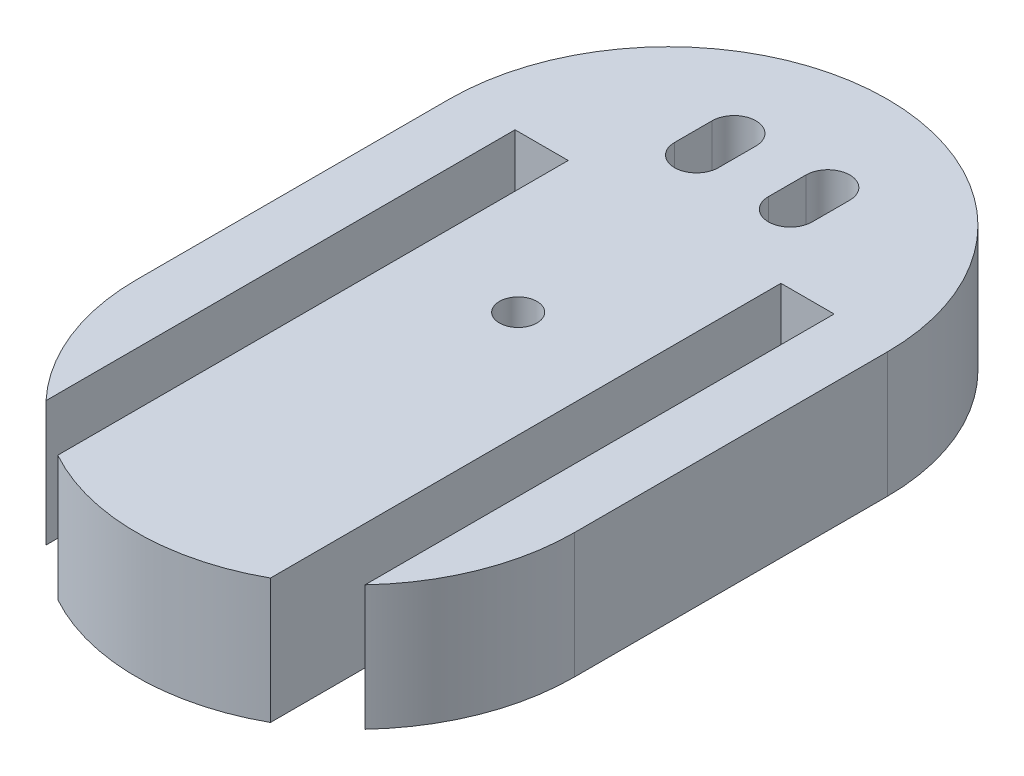
ISO-10303-21;
HEADER;
FILE_DESCRIPTION(('STEP AP214'),'2;1');
FILE_NAME('part.step','',(''),(''),'','','');
FILE_SCHEMA(('AUTOMOTIVE_DESIGN { 1 0 10303 214 1 1 1 1 }'));
ENDSEC;
DATA;
#1=APPLICATION_CONTEXT('core data for automotive mechanical design processes');
#2=APPLICATION_PROTOCOL_DEFINITION('international standard','automotive_design',2000,#1);
#3=PRODUCT_CONTEXT('',#1,'mechanical');
#4=PRODUCT('Part','Part','',(#3));
#5=PRODUCT_RELATED_PRODUCT_CATEGORY('part','',(#4));
#6=PRODUCT_DEFINITION_FORMATION('','',#4);
#7=PRODUCT_DEFINITION_CONTEXT('part definition',#1,'design');
#8=PRODUCT_DEFINITION('design','',#6,#7);
#9=PRODUCT_DEFINITION_SHAPE('','',#8);
#10=(LENGTH_UNIT() NAMED_UNIT(*) SI_UNIT(.MILLI.,.METRE.));
#11=(NAMED_UNIT(*) PLANE_ANGLE_UNIT() SI_UNIT($,.RADIAN.));
#12=(NAMED_UNIT(*) SI_UNIT($,.STERADIAN.) SOLID_ANGLE_UNIT());
#13=UNCERTAINTY_MEASURE_WITH_UNIT(LENGTH_MEASURE(1.E-05),#10,'distance_accuracy_value','');
#14=(GEOMETRIC_REPRESENTATION_CONTEXT(3) GLOBAL_UNCERTAINTY_ASSIGNED_CONTEXT((#13)) GLOBAL_UNIT_ASSIGNED_CONTEXT((#10,
#11,#12)) REPRESENTATION_CONTEXT('',''));
#15=CARTESIAN_POINT('',(0.,0.,0.));
#16=DIRECTION('',(0.,0.,1.));
#17=DIRECTION('',(1.,0.,0.));
#18=AXIS2_PLACEMENT_3D('',#15,#16,#17);
#19=CARTESIAN_POINT('',(0.,4.,10.));
#20=DIRECTION('',(0.,-1.,0.));
#21=DIRECTION('',(0.,0.,-1.));
#22=AXIS2_PLACEMENT_3D('',#19,#20,#21);
#23=CYLINDRICAL_SURFACE('',#22,7.);
#24=CARTESIAN_POINT('',(0.,0.,10.));
#25=DIRECTION('',(0.,1.,0.));
#26=DIRECTION('',(0.,0.,1.));
#27=AXIS2_PLACEMENT_3D('',#24,#25,#26);
#28=CIRCLE('',#27,7.);
#29=CARTESIAN_POINT('',(-7.,0.,10.));
#30=VERTEX_POINT('',#29);
#31=CARTESIAN_POINT('',(-5.1,0.,14.7947888378947));
#32=VERTEX_POINT('',#31);
#33=EDGE_CURVE('E370',#30,#32,#28,.T.);
#34=ORIENTED_EDGE('',*,*,#33,.T.);
#35=DIRECTION('',(0.,-1.,0.));
#36=VECTOR('',#35,1.);
#37=CARTESIAN_POINT('',(-5.1,4.,14.7947888378947));
#38=LINE('',#37,#36);
#39=CARTESIAN_POINT('',(-5.1,4.,14.7947888378947));
#40=VERTEX_POINT('',#39);
#41=EDGE_CURVE('E340',#32,#40,#38,.F.);
#42=ORIENTED_EDGE('',*,*,#41,.T.);
#43=CARTESIAN_POINT('',(0.,4.,10.));
#44=DIRECTION('',(0.,1.,0.));
#45=DIRECTION('',(0.,0.,1.));
#46=AXIS2_PLACEMENT_3D('',#43,#44,#45);
#47=CIRCLE('',#46,7.);
#48=CARTESIAN_POINT('',(-7.,4.,10.));
#49=VERTEX_POINT('',#48);
#50=EDGE_CURVE('E354',#49,#40,#47,.T.);
#51=ORIENTED_EDGE('',*,*,#50,.F.);
#52=DIRECTION('',(0.,-1.,0.));
#53=VECTOR('',#52,1.);
#54=CARTESIAN_POINT('',(-7.,4.,10.));
#55=LINE('',#54,#53);
#56=EDGE_CURVE('E384',#49,#30,#55,.T.);
#57=ORIENTED_EDGE('',*,*,#56,.T.);
#58=EDGE_LOOP('',(#34,#42,#51,#57));
#59=FACE_BOUND('',#58,.T.);
#60=ADVANCED_FACE('F43',(#59),#23,.T.);
#61=CARTESIAN_POINT('',(5.1000000000001,4.,14.7947888378946));
#62=VERTEX_POINT('',#61);
#63=CARTESIAN_POINT('',(7.,4.,10.));
#64=VERTEX_POINT('',#63);
#65=EDGE_CURVE('E353',#62,#64,#47,.T.);
#66=ORIENTED_EDGE('',*,*,#65,.F.);
#67=DIRECTION('',(0.,-1.,0.));
#68=VECTOR('',#67,1.);
#69=CARTESIAN_POINT('',(5.1000000000001,4.,14.7947888378946));
#70=LINE('',#69,#68);
#71=CARTESIAN_POINT('',(5.1000000000001,0.,14.7947888378946));
#72=VERTEX_POINT('',#71);
#73=EDGE_CURVE('E332',#62,#72,#70,.T.);
#74=ORIENTED_EDGE('',*,*,#73,.T.);
#75=CARTESIAN_POINT('',(7.,0.,10.));
#76=VERTEX_POINT('',#75);
#77=EDGE_CURVE('E369',#72,#76,#28,.T.);
#78=ORIENTED_EDGE('',*,*,#77,.T.);
#79=DIRECTION('',(0.,-1.,0.));
#80=VECTOR('',#79,1.);
#81=CARTESIAN_POINT('',(7.,4.,10.));
#82=LINE('',#81,#80);
#83=EDGE_CURVE('E380',#64,#76,#82,.T.);
#84=ORIENTED_EDGE('',*,*,#83,.F.);
#85=EDGE_LOOP('',(#66,#74,#78,#84));
#86=FACE_BOUND('',#85,.T.);
#87=ADVANCED_FACE('F402',(#86),#23,.T.);
#88=CARTESIAN_POINT('',(0.,4.,0.));
#89=DIRECTION('',(0.,-1.,0.));
#90=DIRECTION('',(0.,0.,-1.));
#91=AXIS2_PLACEMENT_3D('',#88,#89,#90);
#92=CYLINDRICAL_SURFACE('',#91,7.);
#93=CARTESIAN_POINT('',(0.,0.,0.));
#94=DIRECTION('',(0.,1.,0.));
#95=DIRECTION('',(0.,0.,1.));
#96=AXIS2_PLACEMENT_3D('',#93,#94,#95);
#97=CIRCLE('',#96,7.);
#98=CARTESIAN_POINT('',(7.,0.,0.));
#99=VERTEX_POINT('',#98);
#100=CARTESIAN_POINT('',(-7.,0.,0.));
#101=VERTEX_POINT('',#100);
#102=EDGE_CURVE('E344',#99,#101,#97,.T.);
#103=ORIENTED_EDGE('',*,*,#102,.T.);
#104=DIRECTION('',(0.,-1.,0.));
#105=VECTOR('',#104,1.);
#106=CARTESIAN_POINT('',(-7.,4.,0.));
#107=LINE('',#106,#105);
#108=CARTESIAN_POINT('',(-7.,4.,0.));
#109=VERTEX_POINT('',#108);
#110=EDGE_CURVE('E388',#109,#101,#107,.T.);
#111=ORIENTED_EDGE('',*,*,#110,.F.);
#112=CARTESIAN_POINT('',(0.,4.,0.));
#113=DIRECTION('',(0.,1.,0.));
#114=DIRECTION('',(0.,0.,1.));
#115=AXIS2_PLACEMENT_3D('',#112,#113,#114);
#116=CIRCLE('',#115,7.);
#117=CARTESIAN_POINT('',(7.,4.,0.));
#118=VERTEX_POINT('',#117);
#119=EDGE_CURVE('E345',#118,#109,#116,.T.);
#120=ORIENTED_EDGE('',*,*,#119,.F.);
#121=DIRECTION('',(0.,-1.,0.));
#122=VECTOR('',#121,1.);
#123=CARTESIAN_POINT('',(7.,4.,0.));
#124=LINE('',#123,#122);
#125=EDGE_CURVE('E362',#118,#99,#124,.T.);
#126=ORIENTED_EDGE('',*,*,#125,.T.);
#127=EDGE_LOOP('',(#103,#111,#120,#126));
#128=FACE_BOUND('',#127,.T.);
#129=ADVANCED_FACE('F45',(#128),#92,.T.);
#130=CARTESIAN_POINT('',(-7.,4.,0.));
#131=DIRECTION('',(1.,0.,0.));
#132=DIRECTION('',(0.,0.,-1.));
#133=AXIS2_PLACEMENT_3D('',#130,#131,#132);
#134=PLANE('',#133);
#135=DIRECTION('',(0.,0.,1.));
#136=VECTOR('',#135,1.);
#137=CARTESIAN_POINT('',(-7.,0.,0.));
#138=LINE('',#137,#136);
#139=EDGE_CURVE('E366',#101,#30,#138,.T.);
#140=ORIENTED_EDGE('',*,*,#139,.T.);
#141=ORIENTED_EDGE('',*,*,#56,.F.);
#142=DIRECTION('',(0.,0.,1.));
#143=VECTOR('',#142,1.);
#144=CARTESIAN_POINT('',(-7.,4.,0.));
#145=LINE('',#144,#143);
#146=EDGE_CURVE('E349',#109,#49,#145,.T.);
#147=ORIENTED_EDGE('',*,*,#146,.F.);
#148=ORIENTED_EDGE('',*,*,#110,.T.);
#149=EDGE_LOOP('',(#140,#141,#147,#148));
#150=FACE_BOUND('',#149,.T.);
#151=ADVANCED_FACE('F440',(#150),#134,.F.);
#152=CARTESIAN_POINT('',(-3.4,4.,16.1188234163113));
#153=VERTEX_POINT('',#152);
#154=CARTESIAN_POINT('',(3.40000000000011,4.,16.1188234163113));
#155=VERTEX_POINT('',#154);
#156=EDGE_CURVE('E359',#153,#155,#47,.T.);
#157=ORIENTED_EDGE('',*,*,#156,.F.);
#158=DIRECTION('',(0.,-1.,0.));
#159=VECTOR('',#158,1.);
#160=CARTESIAN_POINT('',(-3.4,4.,16.1188234163113));
#161=LINE('',#160,#159);
#162=CARTESIAN_POINT('',(-3.4,0.,16.1188234163113));
#163=VERTEX_POINT('',#162);
#164=EDGE_CURVE('E336',#153,#163,#161,.T.);
#165=ORIENTED_EDGE('',*,*,#164,.T.);
#166=CARTESIAN_POINT('',(3.40000000000011,0.,16.1188234163113));
#167=VERTEX_POINT('',#166);
#168=EDGE_CURVE('E374',#163,#167,#28,.T.);
#169=ORIENTED_EDGE('',*,*,#168,.T.);
#170=DIRECTION('',(0.,-1.,0.));
#171=VECTOR('',#170,1.);
#172=CARTESIAN_POINT('',(3.40000000000011,4.,16.1188234163113));
#173=LINE('',#172,#171);
#174=EDGE_CURVE('E302',#167,#155,#173,.F.);
#175=ORIENTED_EDGE('',*,*,#174,.T.);
#176=EDGE_LOOP('',(#157,#165,#169,#175));
#177=FACE_BOUND('',#176,.T.);
#178=ADVANCED_FACE('F417',(#177),#23,.T.);
#179=CARTESIAN_POINT('',(7.,4.,0.));
#180=DIRECTION('',(-1.,0.,0.));
#181=DIRECTION('',(0.,0.,1.));
#182=AXIS2_PLACEMENT_3D('',#179,#180,#181);
#183=PLANE('',#182);
#184=DIRECTION('',(0.,0.,-1.));
#185=VECTOR('',#184,1.);
#186=CARTESIAN_POINT('',(7.,0.,0.));
#187=LINE('',#186,#185);
#188=EDGE_CURVE('E350',#76,#99,#187,.T.);
#189=ORIENTED_EDGE('',*,*,#188,.T.);
#190=ORIENTED_EDGE('',*,*,#125,.F.);
#191=DIRECTION('',(0.,0.,-1.));
#192=VECTOR('',#191,1.);
#193=CARTESIAN_POINT('',(7.,4.,0.));
#194=LINE('',#193,#192);
#195=EDGE_CURVE('E358',#64,#118,#194,.T.);
#196=ORIENTED_EDGE('',*,*,#195,.F.);
#197=ORIENTED_EDGE('',*,*,#83,.T.);
#198=EDGE_LOOP('',(#189,#190,#196,#197));
#199=FACE_BOUND('',#198,.T.);
#200=ADVANCED_FACE('F445',(#199),#183,.F.);
#201=CARTESIAN_POINT('',(0.,4.,0.));
#202=DIRECTION('',(0.,1.,0.));
#203=DIRECTION('',(0.,0.,1.));
#204=AXIS2_PLACEMENT_3D('',#201,#202,#203);
#205=PLANE('',#204);
#206=CARTESIAN_POINT('',(0.,4.,4.8));
#207=DIRECTION('',(0.,1.,0.));
#208=DIRECTION('',(0.,0.,1.));
#209=AXIS2_PLACEMENT_3D('',#206,#207,#208);
#210=CIRCLE('',#209,0.6);
#211=CARTESIAN_POINT('',(0.,4.,5.4));
#212=VERTEX_POINT('',#211);
#213=EDGE_CURVE('E212',#212,#212,#210,.T.);
#214=ORIENTED_EDGE('',*,*,#213,.F.);
#215=EDGE_LOOP('',(#214));
#216=FACE_BOUND('',#215,.T.);
#217=CARTESIAN_POINT('',(-1.5,4.,-2.4));
#218=DIRECTION('',(0.,1.,0.));
#219=DIRECTION('',(0.,0.,1.));
#220=AXIS2_PLACEMENT_3D('',#217,#218,#219);
#221=CIRCLE('',#220,0.7);
#222=CARTESIAN_POINT('',(-2.2,4.,-2.4));
#223=VERTEX_POINT('',#222);
#224=CARTESIAN_POINT('',(-0.8,4.,-2.4));
#225=VERTEX_POINT('',#224);
#226=EDGE_CURVE('E59',#223,#225,#221,.T.);
#227=ORIENTED_EDGE('',*,*,#226,.F.);
#228=DIRECTION('',(0.,0.,1.));
#229=VECTOR('',#228,1.);
#230=CARTESIAN_POINT('',(-2.2,4.,-2.4));
#231=LINE('',#230,#229);
#232=CARTESIAN_POINT('',(-2.2,4.,-3.6));
#233=VERTEX_POINT('',#232);
#234=EDGE_CURVE('E205',#233,#223,#231,.T.);
#235=ORIENTED_EDGE('',*,*,#234,.F.);
#236=CARTESIAN_POINT('',(-1.5,4.,-3.6));
#237=DIRECTION('',(0.,1.,0.));
#238=DIRECTION('',(0.,0.,1.));
#239=AXIS2_PLACEMENT_3D('',#236,#237,#238);
#240=CIRCLE('',#239,0.7);
#241=CARTESIAN_POINT('',(-0.8,4.,-3.6));
#242=VERTEX_POINT('',#241);
#243=EDGE_CURVE('E209',#242,#233,#240,.T.);
#244=ORIENTED_EDGE('',*,*,#243,.F.);
#245=DIRECTION('',(0.,0.,-1.));
#246=VECTOR('',#245,1.);
#247=CARTESIAN_POINT('',(-0.8,4.,-2.4));
#248=LINE('',#247,#246);
#249=EDGE_CURVE('E221',#225,#242,#248,.T.);
#250=ORIENTED_EDGE('',*,*,#249,.F.);
#251=EDGE_LOOP('',(#227,#235,#244,#250));
#252=FACE_BOUND('',#251,.T.);
#253=CARTESIAN_POINT('',(1.49999999999998,4.,-2.4));
#254=DIRECTION('',(0.,1.,0.));
#255=DIRECTION('',(0.,0.,-1.));
#256=AXIS2_PLACEMENT_3D('',#253,#254,#255);
#257=CIRCLE('',#256,0.7);
#258=CARTESIAN_POINT('',(0.799999999999984,4.,-2.4));
#259=VERTEX_POINT('',#258);
#260=CARTESIAN_POINT('',(2.19999999999998,4.,-2.4));
#261=VERTEX_POINT('',#260);
#262=EDGE_CURVE('E67',#259,#261,#257,.T.);
#263=ORIENTED_EDGE('',*,*,#262,.F.);
#264=DIRECTION('',(0.,0.,1.));
#265=VECTOR('',#264,1.);
#266=CARTESIAN_POINT('',(0.799999999999984,4.,-2.4));
#267=LINE('',#266,#265);
#268=CARTESIAN_POINT('',(0.799999999999975,4.,-3.6));
#269=VERTEX_POINT('',#268);
#270=EDGE_CURVE('E242',#269,#259,#267,.T.);
#271=ORIENTED_EDGE('',*,*,#270,.F.);
#272=CARTESIAN_POINT('',(1.49999999999998,4.,-3.6));
#273=DIRECTION('',(0.,1.,0.));
#274=DIRECTION('',(0.,0.,-1.));
#275=AXIS2_PLACEMENT_3D('',#272,#273,#274);
#276=CIRCLE('',#275,0.700000000000001);
#277=CARTESIAN_POINT('',(2.19999999999998,4.,-3.6));
#278=VERTEX_POINT('',#277);
#279=EDGE_CURVE('E262',#278,#269,#276,.T.);
#280=ORIENTED_EDGE('',*,*,#279,.F.);
#281=DIRECTION('',(0.,0.,-1.));
#282=VECTOR('',#281,1.);
#283=CARTESIAN_POINT('',(2.19999999999998,4.,-2.4));
#284=LINE('',#283,#282);
#285=EDGE_CURVE('E257',#261,#278,#284,.T.);
#286=ORIENTED_EDGE('',*,*,#285,.F.);
#287=EDGE_LOOP('',(#263,#271,#280,#286));
#288=FACE_BOUND('',#287,.T.);
#289=DIRECTION('',(0.,0.,1.));
#290=VECTOR('',#289,1.);
#291=CARTESIAN_POINT('',(-5.1,4.,-0.2));
#292=LINE('',#291,#290);
#293=CARTESIAN_POINT('',(-5.1,4.,-0.2));
#294=VERTEX_POINT('',#293);
#295=EDGE_CURVE('E289',#294,#40,#292,.T.);
#296=ORIENTED_EDGE('',*,*,#295,.F.);
#297=DIRECTION('',(-1.,0.,0.));
#298=VECTOR('',#297,1.);
#299=CARTESIAN_POINT('',(-5.1,4.,-0.2));
#300=LINE('',#299,#298);
#301=CARTESIAN_POINT('',(-3.4,4.,-0.2));
#302=VERTEX_POINT('',#301);
#303=EDGE_CURVE('E284',#302,#294,#300,.T.);
#304=ORIENTED_EDGE('',*,*,#303,.F.);
#305=DIRECTION('',(0.,0.,-1.));
#306=VECTOR('',#305,1.);
#307=CARTESIAN_POINT('',(-3.4,4.,-0.2));
#308=LINE('',#307,#306);
#309=EDGE_CURVE('E292',#153,#302,#308,.T.);
#310=ORIENTED_EDGE('',*,*,#309,.F.);
#311=ORIENTED_EDGE('',*,*,#156,.T.);
#312=DIRECTION('',(0.,0.,1.));
#313=VECTOR('',#312,1.);
#314=CARTESIAN_POINT('',(3.4,4.,-0.2));
#315=LINE('',#314,#313);
#316=CARTESIAN_POINT('',(3.4,4.,-0.2));
#317=VERTEX_POINT('',#316);
#318=EDGE_CURVE('E311',#317,#155,#315,.T.);
#319=ORIENTED_EDGE('',*,*,#318,.F.);
#320=DIRECTION('',(-1.,0.,0.));
#321=VECTOR('',#320,1.);
#322=CARTESIAN_POINT('',(5.1,4.,-0.2));
#323=LINE('',#322,#321);
#324=CARTESIAN_POINT('',(5.1,4.,-0.2));
#325=VERTEX_POINT('',#324);
#326=EDGE_CURVE('E318',#325,#317,#323,.T.);
#327=ORIENTED_EDGE('',*,*,#326,.F.);
#328=DIRECTION('',(0.,0.,-1.));
#329=VECTOR('',#328,1.);
#330=CARTESIAN_POINT('',(5.1,4.,-0.2));
#331=LINE('',#330,#329);
#332=EDGE_CURVE('E231',#62,#325,#331,.T.);
#333=ORIENTED_EDGE('',*,*,#332,.F.);
#334=ORIENTED_EDGE('',*,*,#65,.T.);
#335=ORIENTED_EDGE('',*,*,#195,.T.);
#336=ORIENTED_EDGE('',*,*,#119,.T.);
#337=ORIENTED_EDGE('',*,*,#146,.T.);
#338=ORIENTED_EDGE('',*,*,#50,.T.);
#339=EDGE_LOOP('',(#296,#304,#310,#311,#319,#327,#333,#334,#335,#336,#337,#338));
#340=FACE_BOUND('',#339,.T.);
#341=ADVANCED_FACE('F413',(#216,#252,#288,#340),#205,.T.);
#342=CARTESIAN_POINT('',(0.,0.,0.));
#343=DIRECTION('',(0.,1.,0.));
#344=DIRECTION('',(0.,0.,1.));
#345=AXIS2_PLACEMENT_3D('',#342,#343,#344);
#346=PLANE('',#345);
#347=CARTESIAN_POINT('',(0.,0.,4.8));
#348=DIRECTION('',(0.,1.,0.));
#349=DIRECTION('',(0.,0.,1.));
#350=AXIS2_PLACEMENT_3D('',#347,#348,#349);
#351=CIRCLE('',#350,0.6);
#352=CARTESIAN_POINT('',(0.,0.,5.4));
#353=VERTEX_POINT('',#352);
#354=EDGE_CURVE('E258',#353,#353,#351,.T.);
#355=ORIENTED_EDGE('',*,*,#354,.T.);
#356=EDGE_LOOP('',(#355));
#357=FACE_BOUND('',#356,.T.);
#358=DIRECTION('',(0.,0.,1.));
#359=VECTOR('',#358,1.);
#360=CARTESIAN_POINT('',(-2.2,0.,-2.4));
#361=LINE('',#360,#359);
#362=CARTESIAN_POINT('',(-2.2,0.,-3.6));
#363=VERTEX_POINT('',#362);
#364=CARTESIAN_POINT('',(-2.2,0.,-2.4));
#365=VERTEX_POINT('',#364);
#366=EDGE_CURVE('E190',#363,#365,#361,.T.);
#367=ORIENTED_EDGE('',*,*,#366,.T.);
#368=CARTESIAN_POINT('',(-1.5,0.,-2.4));
#369=DIRECTION('',(0.,1.,0.));
#370=DIRECTION('',(0.,0.,1.));
#371=AXIS2_PLACEMENT_3D('',#368,#369,#370);
#372=CIRCLE('',#371,0.7);
#373=CARTESIAN_POINT('',(-0.8,0.,-2.4));
#374=VERTEX_POINT('',#373);
#375=EDGE_CURVE('E183',#365,#374,#372,.T.);
#376=ORIENTED_EDGE('',*,*,#375,.T.);
#377=DIRECTION('',(0.,0.,-1.));
#378=VECTOR('',#377,1.);
#379=CARTESIAN_POINT('',(-0.8,0.,-2.4));
#380=LINE('',#379,#378);
#381=CARTESIAN_POINT('',(-0.8,0.,-3.6));
#382=VERTEX_POINT('',#381);
#383=EDGE_CURVE('E194',#374,#382,#380,.T.);
#384=ORIENTED_EDGE('',*,*,#383,.T.);
#385=CARTESIAN_POINT('',(-1.5,0.,-3.6));
#386=DIRECTION('',(0.,1.,0.));
#387=DIRECTION('',(0.,0.,1.));
#388=AXIS2_PLACEMENT_3D('',#385,#386,#387);
#389=CIRCLE('',#388,0.7);
#390=EDGE_CURVE('E199',#382,#363,#389,.T.);
#391=ORIENTED_EDGE('',*,*,#390,.T.);
#392=EDGE_LOOP('',(#367,#376,#384,#391));
#393=FACE_BOUND('',#392,.T.);
#394=DIRECTION('',(0.,0.,1.));
#395=VECTOR('',#394,1.);
#396=CARTESIAN_POINT('',(0.799999999999984,0.,-2.4));
#397=LINE('',#396,#395);
#398=CARTESIAN_POINT('',(0.799999999999975,0.,-3.6));
#399=VERTEX_POINT('',#398);
#400=CARTESIAN_POINT('',(0.799999999999984,0.,-2.4));
#401=VERTEX_POINT('',#400);
#402=EDGE_CURVE('E250',#399,#401,#397,.T.);
#403=ORIENTED_EDGE('',*,*,#402,.T.);
#404=CARTESIAN_POINT('',(1.49999999999998,0.,-2.4));
#405=DIRECTION('',(0.,1.,0.));
#406=DIRECTION('',(0.,0.,-1.));
#407=AXIS2_PLACEMENT_3D('',#404,#405,#406);
#408=CIRCLE('',#407,0.7);
#409=CARTESIAN_POINT('',(2.19999999999998,0.,-2.4));
#410=VERTEX_POINT('',#409);
#411=EDGE_CURVE('E237',#401,#410,#408,.T.);
#412=ORIENTED_EDGE('',*,*,#411,.T.);
#413=DIRECTION('',(0.,0.,-1.));
#414=VECTOR('',#413,1.);
#415=CARTESIAN_POINT('',(2.19999999999998,0.,-2.4));
#416=LINE('',#415,#414);
#417=CARTESIAN_POINT('',(2.19999999999998,0.,-3.6));
#418=VERTEX_POINT('',#417);
#419=EDGE_CURVE('E241',#410,#418,#416,.T.);
#420=ORIENTED_EDGE('',*,*,#419,.T.);
#421=CARTESIAN_POINT('',(1.49999999999998,0.,-3.6));
#422=DIRECTION('',(0.,1.,0.));
#423=DIRECTION('',(0.,0.,-1.));
#424=AXIS2_PLACEMENT_3D('',#421,#422,#423);
#425=CIRCLE('',#424,0.700000000000001);
#426=EDGE_CURVE('E246',#418,#399,#425,.T.);
#427=ORIENTED_EDGE('',*,*,#426,.T.);
#428=EDGE_LOOP('',(#403,#412,#420,#427));
#429=FACE_BOUND('',#428,.T.);
#430=DIRECTION('',(-1.,0.,0.));
#431=VECTOR('',#430,1.);
#432=CARTESIAN_POINT('',(-5.1,0.,-0.2));
#433=LINE('',#432,#431);
#434=CARTESIAN_POINT('',(-3.4,0.,-0.2));
#435=VERTEX_POINT('',#434);
#436=CARTESIAN_POINT('',(-5.1,0.,-0.2));
#437=VERTEX_POINT('',#436);
#438=EDGE_CURVE('E283',#435,#437,#433,.T.);
#439=ORIENTED_EDGE('',*,*,#438,.T.);
#440=DIRECTION('',(0.,0.,1.));
#441=VECTOR('',#440,1.);
#442=CARTESIAN_POINT('',(-5.1,0.,-0.2));
#443=LINE('',#442,#441);
#444=EDGE_CURVE('E279',#437,#32,#443,.T.);
#445=ORIENTED_EDGE('',*,*,#444,.T.);
#446=ORIENTED_EDGE('',*,*,#33,.F.);
#447=ORIENTED_EDGE('',*,*,#139,.F.);
#448=ORIENTED_EDGE('',*,*,#102,.F.);
#449=ORIENTED_EDGE('',*,*,#188,.F.);
#450=ORIENTED_EDGE('',*,*,#77,.F.);
#451=DIRECTION('',(0.,0.,-1.));
#452=VECTOR('',#451,1.);
#453=CARTESIAN_POINT('',(5.1,0.,0.));
#454=LINE('',#453,#452);
#455=CARTESIAN_POINT('',(5.1,0.,-0.2));
#456=VERTEX_POINT('',#455);
#457=EDGE_CURVE('E52',#72,#456,#454,.T.);
#458=ORIENTED_EDGE('',*,*,#457,.T.);
#459=DIRECTION('',(-1.,0.,0.));
#460=VECTOR('',#459,1.);
#461=CARTESIAN_POINT('',(5.1,0.,-0.2));
#462=LINE('',#461,#460);
#463=CARTESIAN_POINT('',(3.4,0.,-0.2));
#464=VERTEX_POINT('',#463);
#465=EDGE_CURVE('E306',#456,#464,#462,.T.);
#466=ORIENTED_EDGE('',*,*,#465,.T.);
#467=DIRECTION('',(0.,0.,1.));
#468=VECTOR('',#467,1.);
#469=CARTESIAN_POINT('',(3.4,0.,-0.2));
#470=LINE('',#469,#468);
#471=EDGE_CURVE('E310',#464,#167,#470,.T.);
#472=ORIENTED_EDGE('',*,*,#471,.T.);
#473=ORIENTED_EDGE('',*,*,#168,.F.);
#474=DIRECTION('',(0.,0.,-1.));
#475=VECTOR('',#474,1.);
#476=CARTESIAN_POINT('',(-3.4,0.,0.));
#477=LINE('',#476,#475);
#478=EDGE_CURVE('E11',#163,#435,#477,.T.);
#479=ORIENTED_EDGE('',*,*,#478,.T.);
#480=EDGE_LOOP('',(#439,#445,#446,#447,#448,#449,#450,#458,#466,#472,#473,#479));
#481=FACE_BOUND('',#480,.T.);
#482=ADVANCED_FACE('F201',(#357,#393,#429,#481),#346,.F.);
#483=CARTESIAN_POINT('',(5.1,0.,-0.2));
#484=DIRECTION('',(1.,0.,0.));
#485=DIRECTION('',(0.,0.,-1.));
#486=AXIS2_PLACEMENT_3D('',#483,#484,#485);
#487=PLANE('',#486);
#488=ORIENTED_EDGE('',*,*,#332,.T.);
#489=DIRECTION('',(0.,1.,0.));
#490=VECTOR('',#489,1.);
#491=CARTESIAN_POINT('',(5.1,0.,-0.2));
#492=LINE('',#491,#490);
#493=EDGE_CURVE('E315',#456,#325,#492,.T.);
#494=ORIENTED_EDGE('',*,*,#493,.F.);
#495=ORIENTED_EDGE('',*,*,#457,.F.);
#496=ORIENTED_EDGE('',*,*,#73,.F.);
#497=EDGE_LOOP('',(#488,#494,#495,#496));
#498=FACE_BOUND('',#497,.T.);
#499=ADVANCED_FACE('F398',(#498),#487,.F.);
#500=CARTESIAN_POINT('',(3.4,0.,-0.2));
#501=DIRECTION('',(-1.,0.,0.));
#502=DIRECTION('',(0.,0.,1.));
#503=AXIS2_PLACEMENT_3D('',#500,#501,#502);
#504=PLANE('',#503);
#505=ORIENTED_EDGE('',*,*,#471,.F.);
#506=DIRECTION('',(0.,1.,0.));
#507=VECTOR('',#506,1.);
#508=CARTESIAN_POINT('',(3.4,0.,-0.2));
#509=LINE('',#508,#507);
#510=EDGE_CURVE('E293',#464,#317,#509,.T.);
#511=ORIENTED_EDGE('',*,*,#510,.T.);
#512=ORIENTED_EDGE('',*,*,#318,.T.);
#513=ORIENTED_EDGE('',*,*,#174,.F.);
#514=EDGE_LOOP('',(#505,#511,#512,#513));
#515=FACE_BOUND('',#514,.T.);
#516=ADVANCED_FACE('F421',(#515),#504,.F.);
#517=CARTESIAN_POINT('',(5.1,0.,-0.2));
#518=DIRECTION('',(0.,0.,-1.));
#519=DIRECTION('',(-1.,0.,0.));
#520=AXIS2_PLACEMENT_3D('',#517,#518,#519);
#521=PLANE('',#520);
#522=ORIENTED_EDGE('',*,*,#326,.T.);
#523=ORIENTED_EDGE('',*,*,#510,.F.);
#524=ORIENTED_EDGE('',*,*,#465,.F.);
#525=ORIENTED_EDGE('',*,*,#493,.T.);
#526=EDGE_LOOP('',(#522,#523,#524,#525));
#527=FACE_BOUND('',#526,.T.);
#528=ADVANCED_FACE('F499',(#527),#521,.F.);
#529=CARTESIAN_POINT('',(-5.1,0.,-0.2));
#530=DIRECTION('',(-1.,0.,0.));
#531=DIRECTION('',(0.,0.,1.));
#532=AXIS2_PLACEMENT_3D('',#529,#530,#531);
#533=PLANE('',#532);
#534=ORIENTED_EDGE('',*,*,#444,.F.);
#535=DIRECTION('',(0.,1.,0.));
#536=VECTOR('',#535,1.);
#537=CARTESIAN_POINT('',(-5.1,0.,-0.2));
#538=LINE('',#537,#536);
#539=EDGE_CURVE('E299',#437,#294,#538,.T.);
#540=ORIENTED_EDGE('',*,*,#539,.T.);
#541=ORIENTED_EDGE('',*,*,#295,.T.);
#542=ORIENTED_EDGE('',*,*,#41,.F.);
#543=EDGE_LOOP('',(#534,#540,#541,#542));
#544=FACE_BOUND('',#543,.T.);
#545=ADVANCED_FACE('F433',(#544),#533,.F.);
#546=CARTESIAN_POINT('',(-3.4,0.,-0.2));
#547=DIRECTION('',(1.,0.,0.));
#548=DIRECTION('',(0.,0.,-1.));
#549=AXIS2_PLACEMENT_3D('',#546,#547,#548);
#550=PLANE('',#549);
#551=ORIENTED_EDGE('',*,*,#309,.T.);
#552=DIRECTION('',(0.,1.,0.));
#553=VECTOR('',#552,1.);
#554=CARTESIAN_POINT('',(-3.4,0.,-0.2));
#555=LINE('',#554,#553);
#556=EDGE_CURVE('E288',#435,#302,#555,.T.);
#557=ORIENTED_EDGE('',*,*,#556,.F.);
#558=ORIENTED_EDGE('',*,*,#478,.F.);
#559=ORIENTED_EDGE('',*,*,#164,.F.);
#560=EDGE_LOOP('',(#551,#557,#558,#559));
#561=FACE_BOUND('',#560,.T.);
#562=ADVANCED_FACE('F427',(#561),#550,.F.);
#563=CARTESIAN_POINT('',(-5.1,0.,-0.2));
#564=DIRECTION('',(0.,0.,-1.));
#565=DIRECTION('',(-1.,0.,0.));
#566=AXIS2_PLACEMENT_3D('',#563,#564,#565);
#567=PLANE('',#566);
#568=ORIENTED_EDGE('',*,*,#303,.T.);
#569=ORIENTED_EDGE('',*,*,#539,.F.);
#570=ORIENTED_EDGE('',*,*,#438,.F.);
#571=ORIENTED_EDGE('',*,*,#556,.T.);
#572=EDGE_LOOP('',(#568,#569,#570,#571));
#573=FACE_BOUND('',#572,.T.);
#574=ADVANCED_FACE('F429',(#573),#567,.F.);
#575=CARTESIAN_POINT('',(1.49999999999998,0.,-2.4));
#576=DIRECTION('',(0.,1.,0.));
#577=DIRECTION('',(0.,0.,1.));
#578=AXIS2_PLACEMENT_3D('',#575,#576,#577);
#579=CYLINDRICAL_SURFACE('',#578,0.7);
#580=ORIENTED_EDGE('',*,*,#262,.T.);
#581=DIRECTION('',(0.,1.,0.));
#582=VECTOR('',#581,1.);
#583=CARTESIAN_POINT('',(2.19999999999998,0.,-2.4));
#584=LINE('',#583,#582);
#585=EDGE_CURVE('E254',#410,#261,#584,.T.);
#586=ORIENTED_EDGE('',*,*,#585,.F.);
#587=ORIENTED_EDGE('',*,*,#411,.F.);
#588=DIRECTION('',(0.,1.,0.));
#589=VECTOR('',#588,1.);
#590=CARTESIAN_POINT('',(0.799999999999984,0.,-2.4));
#591=LINE('',#590,#589);
#592=EDGE_CURVE('E222',#401,#259,#591,.T.);
#593=ORIENTED_EDGE('',*,*,#592,.T.);
#594=EDGE_LOOP('',(#580,#586,#587,#593));
#595=FACE_BOUND('',#594,.T.);
#596=ADVANCED_FACE('F533',(#595),#579,.F.);
#597=CARTESIAN_POINT('',(0.799999999999984,0.,-2.4));
#598=DIRECTION('',(-1.,0.,0.));
#599=DIRECTION('',(0.,0.,1.));
#600=AXIS2_PLACEMENT_3D('',#597,#598,#599);
#601=PLANE('',#600);
#602=ORIENTED_EDGE('',*,*,#270,.T.);
#603=ORIENTED_EDGE('',*,*,#592,.F.);
#604=ORIENTED_EDGE('',*,*,#402,.F.);
#605=DIRECTION('',(0.,1.,0.));
#606=VECTOR('',#605,1.);
#607=CARTESIAN_POINT('',(0.799999999999975,0.,-3.6));
#608=LINE('',#607,#606);
#609=EDGE_CURVE('E271',#399,#269,#608,.T.);
#610=ORIENTED_EDGE('',*,*,#609,.T.);
#611=EDGE_LOOP('',(#602,#603,#604,#610));
#612=FACE_BOUND('',#611,.T.);
#613=ADVANCED_FACE('F542',(#612),#601,.F.);
#614=CARTESIAN_POINT('',(1.49999999999998,0.,-3.6));
#615=DIRECTION('',(0.,1.,0.));
#616=DIRECTION('',(0.,0.,1.));
#617=AXIS2_PLACEMENT_3D('',#614,#615,#616);
#618=CYLINDRICAL_SURFACE('',#617,0.700000000000001);
#619=ORIENTED_EDGE('',*,*,#279,.T.);
#620=ORIENTED_EDGE('',*,*,#609,.F.);
#621=ORIENTED_EDGE('',*,*,#426,.F.);
#622=DIRECTION('',(0.,1.,0.));
#623=VECTOR('',#622,1.);
#624=CARTESIAN_POINT('',(2.19999999999998,0.,-3.6));
#625=LINE('',#624,#623);
#626=EDGE_CURVE('E274',#418,#278,#625,.T.);
#627=ORIENTED_EDGE('',*,*,#626,.T.);
#628=EDGE_LOOP('',(#619,#620,#621,#627));
#629=FACE_BOUND('',#628,.T.);
#630=ADVANCED_FACE('F551',(#629),#618,.F.);
#631=CARTESIAN_POINT('',(2.19999999999998,0.,-2.4));
#632=DIRECTION('',(1.,0.,0.));
#633=DIRECTION('',(0.,0.,-1.));
#634=AXIS2_PLACEMENT_3D('',#631,#632,#633);
#635=PLANE('',#634);
#636=ORIENTED_EDGE('',*,*,#285,.T.);
#637=ORIENTED_EDGE('',*,*,#626,.F.);
#638=ORIENTED_EDGE('',*,*,#419,.F.);
#639=ORIENTED_EDGE('',*,*,#585,.T.);
#640=EDGE_LOOP('',(#636,#637,#638,#639));
#641=FACE_BOUND('',#640,.T.);
#642=ADVANCED_FACE('F561',(#641),#635,.F.);
#643=CARTESIAN_POINT('',(-1.5,0.,-2.4));
#644=DIRECTION('',(0.,1.,0.));
#645=DIRECTION('',(0.,0.,1.));
#646=AXIS2_PLACEMENT_3D('',#643,#644,#645);
#647=CYLINDRICAL_SURFACE('',#646,0.7);
#648=ORIENTED_EDGE('',*,*,#226,.T.);
#649=DIRECTION('',(0.,1.,0.));
#650=VECTOR('',#649,1.);
#651=CARTESIAN_POINT('',(-0.8,0.,-2.4));
#652=LINE('',#651,#650);
#653=EDGE_CURVE('E179',#374,#225,#652,.T.);
#654=ORIENTED_EDGE('',*,*,#653,.F.);
#655=ORIENTED_EDGE('',*,*,#375,.F.);
#656=DIRECTION('',(0.,1.,0.));
#657=VECTOR('',#656,1.);
#658=CARTESIAN_POINT('',(-2.2,0.,-2.4));
#659=LINE('',#658,#657);
#660=EDGE_CURVE('E228',#365,#223,#659,.T.);
#661=ORIENTED_EDGE('',*,*,#660,.T.);
#662=EDGE_LOOP('',(#648,#654,#655,#661));
#663=FACE_BOUND('',#662,.T.);
#664=ADVANCED_FACE('F181',(#663),#647,.F.);
#665=CARTESIAN_POINT('',(-2.2,0.,-2.4));
#666=DIRECTION('',(-1.,0.,0.));
#667=DIRECTION('',(0.,0.,1.));
#668=AXIS2_PLACEMENT_3D('',#665,#666,#667);
#669=PLANE('',#668);
#670=ORIENTED_EDGE('',*,*,#234,.T.);
#671=ORIENTED_EDGE('',*,*,#660,.F.);
#672=ORIENTED_EDGE('',*,*,#366,.F.);
#673=DIRECTION('',(0.,1.,0.));
#674=VECTOR('',#673,1.);
#675=CARTESIAN_POINT('',(-2.2,0.,-3.6));
#676=LINE('',#675,#674);
#677=EDGE_CURVE('E232',#363,#233,#676,.T.);
#678=ORIENTED_EDGE('',*,*,#677,.T.);
#679=EDGE_LOOP('',(#670,#671,#672,#678));
#680=FACE_BOUND('',#679,.T.);
#681=ADVANCED_FACE('F580',(#680),#669,.F.);
#682=CARTESIAN_POINT('',(-1.5,0.,-3.6));
#683=DIRECTION('',(0.,1.,0.));
#684=DIRECTION('',(0.,0.,1.));
#685=AXIS2_PLACEMENT_3D('',#682,#683,#684);
#686=CYLINDRICAL_SURFACE('',#685,0.7);
#687=ORIENTED_EDGE('',*,*,#243,.T.);
#688=ORIENTED_EDGE('',*,*,#677,.F.);
#689=ORIENTED_EDGE('',*,*,#390,.F.);
#690=DIRECTION('',(0.,1.,0.));
#691=VECTOR('',#690,1.);
#692=CARTESIAN_POINT('',(-0.8,0.,-3.6));
#693=LINE('',#692,#691);
#694=EDGE_CURVE('E189',#382,#242,#693,.T.);
#695=ORIENTED_EDGE('',*,*,#694,.T.);
#696=EDGE_LOOP('',(#687,#688,#689,#695));
#697=FACE_BOUND('',#696,.T.);
#698=ADVANCED_FACE('F589',(#697),#686,.F.);
#699=CARTESIAN_POINT('',(-0.8,0.,-2.4));
#700=DIRECTION('',(1.,0.,0.));
#701=DIRECTION('',(0.,0.,-1.));
#702=AXIS2_PLACEMENT_3D('',#699,#700,#701);
#703=PLANE('',#702);
#704=ORIENTED_EDGE('',*,*,#249,.T.);
#705=ORIENTED_EDGE('',*,*,#694,.F.);
#706=ORIENTED_EDGE('',*,*,#383,.F.);
#707=ORIENTED_EDGE('',*,*,#653,.T.);
#708=EDGE_LOOP('',(#704,#705,#706,#707));
#709=FACE_BOUND('',#708,.T.);
#710=ADVANCED_FACE('F195',(#709),#703,.F.);
#711=CARTESIAN_POINT('',(0.,0.,4.8));
#712=DIRECTION('',(0.,1.,0.));
#713=DIRECTION('',(0.,0.,1.));
#714=AXIS2_PLACEMENT_3D('',#711,#712,#713);
#715=CYLINDRICAL_SURFACE('',#714,0.6);
#716=ORIENTED_EDGE('',*,*,#354,.F.);
#717=EDGE_LOOP('',(#716));
#718=FACE_BOUND('',#717,.T.);
#719=ORIENTED_EDGE('',*,*,#213,.T.);
#720=EDGE_LOOP('',(#719));
#721=FACE_BOUND('',#720,.T.);
#722=ADVANCED_FACE('F608',(#718,#721),#715,.F.);
#723=CLOSED_SHELL('',(#60,#87,#129,#151,#178,#200,#341,#482,#499,#516,#528,#545,#562,#574,#596,
#613,#630,#642,#664,#681,#698,#710,#722));
#724=MANIFOLD_SOLID_BREP('B2',#723);
#725=ADVANCED_BREP_SHAPE_REPRESENTATION('',(#18,#724),#14);
#726=SHAPE_DEFINITION_REPRESENTATION(#9,#725);
ENDSEC;
END-ISO-10303-21;
